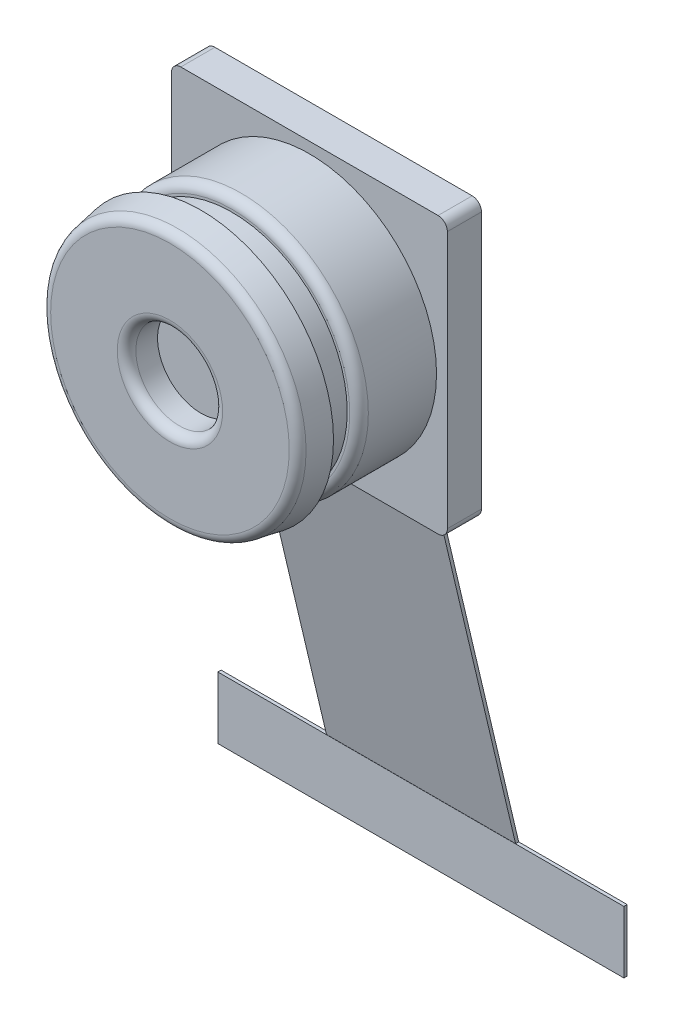
ISO-10303-21;
HEADER;
FILE_DESCRIPTION(('STEP AP214'),'2;1');
FILE_NAME('part.step','',(''),(''),'','','');
FILE_SCHEMA(('AUTOMOTIVE_DESIGN { 1 0 10303 214 1 1 1 1 }'));
ENDSEC;
DATA;
#1=APPLICATION_CONTEXT('core data for automotive mechanical design processes');
#2=APPLICATION_PROTOCOL_DEFINITION('international standard','automotive_design',2000,#1);
#3=PRODUCT_CONTEXT('',#1,'mechanical');
#4=PRODUCT('Part','Part','',(#3));
#5=PRODUCT_RELATED_PRODUCT_CATEGORY('part','',(#4));
#6=PRODUCT_DEFINITION_FORMATION('','',#4);
#7=PRODUCT_DEFINITION_CONTEXT('part definition',#1,'design');
#8=PRODUCT_DEFINITION('design','',#6,#7);
#9=PRODUCT_DEFINITION_SHAPE('','',#8);
#10=(LENGTH_UNIT() NAMED_UNIT(*) SI_UNIT(.MILLI.,.METRE.));
#11=(NAMED_UNIT(*) PLANE_ANGLE_UNIT() SI_UNIT($,.RADIAN.));
#12=(NAMED_UNIT(*) SI_UNIT($,.STERADIAN.) SOLID_ANGLE_UNIT());
#13=UNCERTAINTY_MEASURE_WITH_UNIT(LENGTH_MEASURE(1.E-05),#10,'distance_accuracy_value','');
#14=(GEOMETRIC_REPRESENTATION_CONTEXT(3) GLOBAL_UNCERTAINTY_ASSIGNED_CONTEXT((#13)) GLOBAL_UNIT_ASSIGNED_CONTEXT((#10,
#11,#12)) REPRESENTATION_CONTEXT('',''));
#15=CARTESIAN_POINT('',(0.,0.,0.));
#16=DIRECTION('',(0.,0.,1.));
#17=DIRECTION('',(1.,0.,0.));
#18=AXIS2_PLACEMENT_3D('',#15,#16,#17);
#19=CARTESIAN_POINT('',(-0.396010785207714,1.78,5.6));
#20=DIRECTION('',(0.,0.,-1.));
#21=DIRECTION('',(-1.,0.,0.));
#22=AXIS2_PLACEMENT_3D('',#19,#20,#21);
#23=CYLINDRICAL_SURFACE('',#22,3.71911807197977);
#24=CARTESIAN_POINT('',(-0.396010785207714,1.78,3.6));
#25=DIRECTION('',(0.,0.,1.));
#26=DIRECTION('',(1.,0.,0.));
#27=AXIS2_PLACEMENT_3D('',#24,#25,#26);
#28=CIRCLE('',#27,3.71911807197977);
#29=CARTESIAN_POINT('',(3.32310728677206,1.78,3.6));
#30=VERTEX_POINT('',#29);
#31=EDGE_CURVE('E187',#30,#30,#28,.T.);
#32=ORIENTED_EDGE('',*,*,#31,.T.);
#33=EDGE_LOOP('',(#32));
#34=FACE_BOUND('',#33,.T.);
#35=CARTESIAN_POINT('',(-0.396010785207714,1.78,4.6));
#36=DIRECTION('',(0.,0.,1.));
#37=DIRECTION('',(1.,0.,0.));
#38=AXIS2_PLACEMENT_3D('',#35,#36,#37);
#39=CIRCLE('',#38,3.71911807197977);
#40=CARTESIAN_POINT('',(3.32310728677206,1.78,4.6));
#41=VERTEX_POINT('',#40);
#42=EDGE_CURVE('E183',#41,#41,#39,.T.);
#43=ORIENTED_EDGE('',*,*,#42,.F.);
#44=EDGE_LOOP('',(#43));
#45=FACE_BOUND('',#44,.T.);
#46=ADVANCED_FACE('F37',(#34,#45),#23,.T.);
#47=CARTESIAN_POINT('',(-4.84601078520772,6.23,0.1));
#48=DIRECTION('',(1.,0.,0.));
#49=DIRECTION('',(0.,1.,0.));
#50=AXIS2_PLACEMENT_3D('',#47,#48,#49);
#51=PLANE('',#50);
#52=DIRECTION('',(0.,-1.,0.));
#53=VECTOR('',#52,1.);
#54=CARTESIAN_POINT('',(-4.84601078520772,6.23,0.));
#55=LINE('',#54,#53);
#56=CARTESIAN_POINT('',(-4.84601078520772,5.93,0.));
#57=VERTEX_POINT('',#56);
#58=CARTESIAN_POINT('',(-4.84601078520772,-2.37,0.));
#59=VERTEX_POINT('',#58);
#60=EDGE_CURVE('E281',#57,#59,#55,.T.);
#61=ORIENTED_EDGE('',*,*,#60,.T.);
#62=DIRECTION('',(0.,0.,-1.));
#63=VECTOR('',#62,1.);
#64=CARTESIAN_POINT('',(-4.84601078520772,-2.37,0.1));
#65=LINE('',#64,#63);
#66=CARTESIAN_POINT('',(-4.84601078520772,-2.37,1.1));
#67=VERTEX_POINT('',#66);
#68=EDGE_CURVE('E232',#59,#67,#65,.F.);
#69=ORIENTED_EDGE('',*,*,#68,.T.);
#70=DIRECTION('',(0.,-1.,0.));
#71=VECTOR('',#70,1.);
#72=CARTESIAN_POINT('',(-4.84601078520772,6.23,1.1));
#73=LINE('',#72,#71);
#74=CARTESIAN_POINT('',(-4.84601078520772,5.93,1.1));
#75=VERTEX_POINT('',#74);
#76=EDGE_CURVE('E260',#75,#67,#73,.T.);
#77=ORIENTED_EDGE('',*,*,#76,.F.);
#78=DIRECTION('',(0.,0.,-1.));
#79=VECTOR('',#78,1.);
#80=CARTESIAN_POINT('',(-4.84601078520772,5.93,0.1));
#81=LINE('',#80,#79);
#82=EDGE_CURVE('E229',#75,#57,#81,.T.);
#83=ORIENTED_EDGE('',*,*,#82,.T.);
#84=EDGE_LOOP('',(#61,#69,#77,#83));
#85=FACE_BOUND('',#84,.T.);
#86=ADVANCED_FACE('F370',(#85),#51,.F.);
#87=CARTESIAN_POINT('',(-3.44601078520772,-2.67,0.1));
#88=DIRECTION('',(1.,0.,0.));
#89=DIRECTION('',(0.,1.,0.));
#90=AXIS2_PLACEMENT_3D('',#87,#88,#89);
#91=PLANE('',#90);
#92=DIRECTION('',(0.,0.,-1.));
#93=VECTOR('',#92,1.);
#94=CARTESIAN_POINT('',(-3.44601078520771,-13.67,0.1));
#95=LINE('',#94,#93);
#96=CARTESIAN_POINT('',(-3.44601078520771,-13.67,-2.5));
#97=VERTEX_POINT('',#96);
#98=CARTESIAN_POINT('',(-3.44601078520771,-13.67,-2.6));
#99=VERTEX_POINT('',#98);
#100=EDGE_CURVE('E172',#97,#99,#95,.T.);
#101=ORIENTED_EDGE('',*,*,#100,.F.);
#102=DIRECTION('',(0.,-0.97318461277641,-0.23002545392897));
#103=VECTOR('',#102,1.);
#104=CARTESIAN_POINT('',(-3.44601078520772,-2.67,0.1));
#105=LINE('',#104,#103);
#106=CARTESIAN_POINT('',(-3.44601078520772,-2.67,0.1));
#107=VERTEX_POINT('',#106);
#108=EDGE_CURVE('E334',#107,#97,#105,.T.);
#109=ORIENTED_EDGE('',*,*,#108,.F.);
#110=DIRECTION('',(0.,0.,-1.));
#111=VECTOR('',#110,1.);
#112=CARTESIAN_POINT('',(-3.44601078520772,-2.67,0.1));
#113=LINE('',#112,#111);
#114=CARTESIAN_POINT('',(-3.44601078520772,-2.67,0.));
#115=VERTEX_POINT('',#114);
#116=EDGE_CURVE('E174',#107,#115,#113,.T.);
#117=ORIENTED_EDGE('',*,*,#116,.T.);
#118=DIRECTION('',(0.,0.97318461277641,0.23002545392897));
#119=VECTOR('',#118,1.);
#120=CARTESIAN_POINT('',(-3.44601078520772,-2.67,0.));
#121=LINE('',#120,#119);
#122=EDGE_CURVE('E326',#99,#115,#121,.T.);
#123=ORIENTED_EDGE('',*,*,#122,.F.);
#124=EDGE_LOOP('',(#101,#109,#117,#123));
#125=FACE_BOUND('',#124,.T.);
#126=ADVANCED_FACE('F346',(#125),#91,.F.);
#127=CARTESIAN_POINT('',(-6.94601078520771,-13.67,0.1));
#128=DIRECTION('',(1.,0.,0.));
#129=DIRECTION('',(0.,0.,-1.));
#130=AXIS2_PLACEMENT_3D('',#127,#128,#129);
#131=PLANE('',#130);
#132=DIRECTION('',(0.,0.,-1.));
#133=VECTOR('',#132,1.);
#134=CARTESIAN_POINT('',(-6.94601078520771,-15.67,0.1));
#135=LINE('',#134,#133);
#136=CARTESIAN_POINT('',(-6.94601078520771,-15.67,-2.49407294755794));
#137=VERTEX_POINT('',#136);
#138=CARTESIAN_POINT('',(-6.94601078520771,-15.67,-2.6));
#139=VERTEX_POINT('',#138);
#140=EDGE_CURVE('E165',#137,#139,#135,.T.);
#141=ORIENTED_EDGE('',*,*,#140,.F.);
#142=DIRECTION('',(0.,-1.,0.));
#143=VECTOR('',#142,1.);
#144=CARTESIAN_POINT('',(-6.94601078520771,-15.67,-2.49407294755794));
#145=LINE('',#144,#143);
#146=CARTESIAN_POINT('',(-6.94601078520771,-13.67,-2.49407294755794));
#147=VERTEX_POINT('',#146);
#148=EDGE_CURVE('E152',#147,#137,#145,.T.);
#149=ORIENTED_EDGE('',*,*,#148,.F.);
#150=DIRECTION('',(0.,0.,-1.));
#151=VECTOR('',#150,1.);
#152=CARTESIAN_POINT('',(-6.94601078520771,-13.67,0.1));
#153=LINE('',#152,#151);
#154=CARTESIAN_POINT('',(-6.94601078520771,-13.67,-2.6));
#155=VERTEX_POINT('',#154);
#156=EDGE_CURVE('E163',#147,#155,#153,.T.);
#157=ORIENTED_EDGE('',*,*,#156,.T.);
#158=DIRECTION('',(0.,1.,0.));
#159=VECTOR('',#158,1.);
#160=CARTESIAN_POINT('',(-6.94601078520771,-13.67,-2.6));
#161=LINE('',#160,#159);
#162=EDGE_CURVE('E262',#139,#155,#161,.T.);
#163=ORIENTED_EDGE('',*,*,#162,.F.);
#164=EDGE_LOOP('',(#141,#149,#157,#163));
#165=FACE_BOUND('',#164,.T.);
#166=ADVANCED_FACE('F161',(#165),#131,.F.);
#167=CARTESIAN_POINT('',(-6.94601078520771,-15.67,0.1));
#168=DIRECTION('',(0.,1.,0.));
#169=DIRECTION('',(0.,0.,1.));
#170=AXIS2_PLACEMENT_3D('',#167,#168,#169);
#171=PLANE('',#170);
#172=DIRECTION('',(0.,0.,-1.));
#173=VECTOR('',#172,1.);
#174=CARTESIAN_POINT('',(6.15398921479229,-15.67,0.1));
#175=LINE('',#174,#173);
#176=CARTESIAN_POINT('',(6.15398921479229,-15.67,-2.49407294755794));
#177=VERTEX_POINT('',#176);
#178=CARTESIAN_POINT('',(6.15398921479229,-15.67,-2.6));
#179=VERTEX_POINT('',#178);
#180=EDGE_CURVE('E176',#177,#179,#175,.T.);
#181=ORIENTED_EDGE('',*,*,#180,.F.);
#182=DIRECTION('',(-1.,0.,0.));
#183=VECTOR('',#182,1.);
#184=CARTESIAN_POINT('',(6.15498921479229,-15.67,-2.49407294755794));
#185=LINE('',#184,#183);
#186=EDGE_CURVE('E157',#177,#137,#185,.T.);
#187=ORIENTED_EDGE('',*,*,#186,.T.);
#188=ORIENTED_EDGE('',*,*,#140,.T.);
#189=DIRECTION('',(-1.,0.,0.));
#190=VECTOR('',#189,1.);
#191=CARTESIAN_POINT('',(-6.94601078520771,-15.67,-2.6));
#192=LINE('',#191,#190);
#193=EDGE_CURVE('E315',#179,#139,#192,.T.);
#194=ORIENTED_EDGE('',*,*,#193,.F.);
#195=EDGE_LOOP('',(#181,#187,#188,#194));
#196=FACE_BOUND('',#195,.T.);
#197=ADVANCED_FACE('F320',(#196),#171,.F.);
#198=CARTESIAN_POINT('',(6.15398921479229,-13.67,0.1));
#199=DIRECTION('',(-1.,0.,0.));
#200=DIRECTION('',(0.,0.,1.));
#201=AXIS2_PLACEMENT_3D('',#198,#199,#200);
#202=PLANE('',#201);
#203=DIRECTION('',(0.,0.,-1.));
#204=VECTOR('',#203,1.);
#205=CARTESIAN_POINT('',(6.15398921479229,-13.67,0.1));
#206=LINE('',#205,#204);
#207=CARTESIAN_POINT('',(6.15398921479229,-13.67,-2.49407294755794));
#208=VERTEX_POINT('',#207);
#209=CARTESIAN_POINT('',(6.15398921479229,-13.67,-2.6));
#210=VERTEX_POINT('',#209);
#211=EDGE_CURVE('E303',#208,#210,#206,.T.);
#212=ORIENTED_EDGE('',*,*,#211,.F.);
#213=DIRECTION('',(0.,1.,0.));
#214=VECTOR('',#213,1.);
#215=CARTESIAN_POINT('',(6.15398921479229,-15.67,-2.49407294755794));
#216=LINE('',#215,#214);
#217=EDGE_CURVE('E52',#177,#208,#216,.T.);
#218=ORIENTED_EDGE('',*,*,#217,.F.);
#219=ORIENTED_EDGE('',*,*,#180,.T.);
#220=DIRECTION('',(0.,-1.,0.));
#221=VECTOR('',#220,1.);
#222=CARTESIAN_POINT('',(6.15398921479229,-13.67,-2.6));
#223=LINE('',#222,#221);
#224=EDGE_CURVE('E309',#210,#179,#223,.T.);
#225=ORIENTED_EDGE('',*,*,#224,.F.);
#226=EDGE_LOOP('',(#212,#218,#219,#225));
#227=FACE_BOUND('',#226,.T.);
#228=ADVANCED_FACE('F308',(#227),#202,.F.);
#229=CARTESIAN_POINT('',(2.65398921479229,-13.67,0.1));
#230=DIRECTION('',(0.,-1.,0.));
#231=DIRECTION('',(0.,0.,-1.));
#232=AXIS2_PLACEMENT_3D('',#229,#230,#231);
#233=PLANE('',#232);
#234=ORIENTED_EDGE('',*,*,#156,.F.);
#235=DIRECTION('',(-1.,0.,0.));
#236=VECTOR('',#235,1.);
#237=CARTESIAN_POINT('',(6.15498921479229,-13.67,-2.49407294755794));
#238=LINE('',#237,#236);
#239=EDGE_CURVE('E149',#208,#147,#238,.T.);
#240=ORIENTED_EDGE('',*,*,#239,.F.);
#241=ORIENTED_EDGE('',*,*,#211,.T.);
#242=DIRECTION('',(1.,0.,0.));
#243=VECTOR('',#242,1.);
#244=CARTESIAN_POINT('',(2.65398921479229,-13.67,-2.6));
#245=LINE('',#244,#243);
#246=CARTESIAN_POINT('',(2.65398921479229,-13.67,-2.6));
#247=VERTEX_POINT('',#246);
#248=EDGE_CURVE('E318',#247,#210,#245,.T.);
#249=ORIENTED_EDGE('',*,*,#248,.F.);
#250=DIRECTION('',(0.,0.,-1.));
#251=VECTOR('',#250,1.);
#252=CARTESIAN_POINT('',(2.65398921479229,-13.67,0.1));
#253=LINE('',#252,#251);
#254=CARTESIAN_POINT('',(2.65398921479229,-13.67,-2.5));
#255=VERTEX_POINT('',#254);
#256=EDGE_CURVE('E300',#255,#247,#253,.T.);
#257=ORIENTED_EDGE('',*,*,#256,.F.);
#258=DIRECTION('',(-1.,0.,0.));
#259=VECTOR('',#258,1.);
#260=CARTESIAN_POINT('',(6.15498921479229,-13.67,-2.5));
#261=LINE('',#260,#259);
#262=EDGE_CURVE('E332',#255,#97,#261,.T.);
#263=ORIENTED_EDGE('',*,*,#262,.T.);
#264=ORIENTED_EDGE('',*,*,#100,.T.);
#265=DIRECTION('',(1.,0.,0.));
#266=VECTOR('',#265,1.);
#267=CARTESIAN_POINT('',(-6.94601078520771,-13.67,-2.6));
#268=LINE('',#267,#266);
#269=EDGE_CURVE('E171',#155,#99,#268,.T.);
#270=ORIENTED_EDGE('',*,*,#269,.F.);
#271=EDGE_LOOP('',(#234,#240,#241,#249,#257,#263,#264,#270));
#272=FACE_BOUND('',#271,.T.);
#273=ADVANCED_FACE('F168',(#272),#233,.F.);
#274=CARTESIAN_POINT('',(2.65398921479229,-2.67,0.1));
#275=DIRECTION('',(-1.,0.,0.));
#276=DIRECTION('',(0.,-1.,0.));
#277=AXIS2_PLACEMENT_3D('',#274,#275,#276);
#278=PLANE('',#277);
#279=DIRECTION('',(0.,0.,-1.));
#280=VECTOR('',#279,1.);
#281=CARTESIAN_POINT('',(2.65398921479229,-2.67,0.1));
#282=LINE('',#281,#280);
#283=CARTESIAN_POINT('',(2.65398921479229,-2.67,0.1));
#284=VERTEX_POINT('',#283);
#285=CARTESIAN_POINT('',(2.65398921479229,-2.67,0.));
#286=VERTEX_POINT('',#285);
#287=EDGE_CURVE('E297',#284,#286,#282,.T.);
#288=ORIENTED_EDGE('',*,*,#287,.F.);
#289=DIRECTION('',(0.,0.97318461277641,0.23002545392897));
#290=VECTOR('',#289,1.);
#291=CARTESIAN_POINT('',(2.65398921479229,-2.67,0.0999999999999999));
#292=LINE('',#291,#290);
#293=EDGE_CURVE('E330',#255,#284,#292,.T.);
#294=ORIENTED_EDGE('',*,*,#293,.F.);
#295=ORIENTED_EDGE('',*,*,#256,.T.);
#296=DIRECTION('',(0.,-0.97318461277641,-0.23002545392897));
#297=VECTOR('',#296,1.);
#298=CARTESIAN_POINT('',(2.65398921479229,-2.67,0.));
#299=LINE('',#298,#297);
#300=EDGE_CURVE('E328',#286,#247,#299,.T.);
#301=ORIENTED_EDGE('',*,*,#300,.F.);
#302=EDGE_LOOP('',(#288,#294,#295,#301));
#303=FACE_BOUND('',#302,.T.);
#304=ADVANCED_FACE('F352',(#303),#278,.F.);
#305=CARTESIAN_POINT('',(2.65398921479229,-2.67,0.1));
#306=DIRECTION('',(0.,1.,0.));
#307=DIRECTION('',(0.,0.,1.));
#308=AXIS2_PLACEMENT_3D('',#305,#306,#307);
#309=PLANE('',#308);
#310=DIRECTION('',(1.,0.,0.));
#311=VECTOR('',#310,1.);
#312=CARTESIAN_POINT('',(2.65398921479229,-2.67,0.));
#313=LINE('',#312,#311);
#314=CARTESIAN_POINT('',(3.75398921479229,-2.67,0.));
#315=VERTEX_POINT('',#314);
#316=EDGE_CURVE('E289',#286,#315,#313,.T.);
#317=ORIENTED_EDGE('',*,*,#316,.T.);
#318=DIRECTION('',(0.,0.,-1.));
#319=VECTOR('',#318,1.);
#320=CARTESIAN_POINT('',(3.75398921479229,-2.67,0.1));
#321=LINE('',#320,#319);
#322=CARTESIAN_POINT('',(3.75398921479229,-2.67,1.1));
#323=VERTEX_POINT('',#322);
#324=EDGE_CURVE('E60',#315,#323,#321,.F.);
#325=ORIENTED_EDGE('',*,*,#324,.T.);
#326=DIRECTION('',(1.,0.,0.));
#327=VECTOR('',#326,1.);
#328=CARTESIAN_POINT('',(-4.84601078520772,-2.67,1.1));
#329=LINE('',#328,#327);
#330=CARTESIAN_POINT('',(-4.54601078520772,-2.67,1.1));
#331=VERTEX_POINT('',#330);
#332=EDGE_CURVE('E273',#331,#323,#329,.T.);
#333=ORIENTED_EDGE('',*,*,#332,.F.);
#334=DIRECTION('',(0.,0.,-1.));
#335=VECTOR('',#334,1.);
#336=CARTESIAN_POINT('',(-4.54601078520772,-2.67,0.1));
#337=LINE('',#336,#335);
#338=CARTESIAN_POINT('',(-4.54601078520772,-2.67,0.));
#339=VERTEX_POINT('',#338);
#340=EDGE_CURVE('E225',#331,#339,#337,.T.);
#341=ORIENTED_EDGE('',*,*,#340,.T.);
#342=DIRECTION('',(1.,0.,0.));
#343=VECTOR('',#342,1.);
#344=CARTESIAN_POINT('',(-4.84601078520772,-2.67,0.));
#345=LINE('',#344,#343);
#346=EDGE_CURVE('E286',#339,#115,#345,.T.);
#347=ORIENTED_EDGE('',*,*,#346,.T.);
#348=ORIENTED_EDGE('',*,*,#116,.F.);
#349=DIRECTION('',(1.,0.,0.));
#350=VECTOR('',#349,1.);
#351=CARTESIAN_POINT('',(-4.84601078520772,-2.67,0.1));
#352=LINE('',#351,#350);
#353=EDGE_CURVE('E182',#107,#284,#352,.T.);
#354=ORIENTED_EDGE('',*,*,#353,.T.);
#355=ORIENTED_EDGE('',*,*,#287,.T.);
#356=EDGE_LOOP('',(#317,#325,#333,#341,#347,#348,#354,#355));
#357=FACE_BOUND('',#356,.T.);
#358=ADVANCED_FACE('F354',(#357),#309,.F.);
#359=CARTESIAN_POINT('',(4.05398921479228,6.23,0.1));
#360=DIRECTION('',(-1.,0.,0.));
#361=DIRECTION('',(0.,-1.,0.));
#362=AXIS2_PLACEMENT_3D('',#359,#360,#361);
#363=PLANE('',#362);
#364=DIRECTION('',(0.,1.,0.));
#365=VECTOR('',#364,1.);
#366=CARTESIAN_POINT('',(4.05398921479228,6.23,0.));
#367=LINE('',#366,#365);
#368=CARTESIAN_POINT('',(4.05398921479229,-2.37,0.));
#369=VERTEX_POINT('',#368);
#370=CARTESIAN_POINT('',(4.05398921479228,5.93,0.));
#371=VERTEX_POINT('',#370);
#372=EDGE_CURVE('E291',#369,#371,#367,.T.);
#373=ORIENTED_EDGE('',*,*,#372,.T.);
#374=DIRECTION('',(0.,0.,-1.));
#375=VECTOR('',#374,1.);
#376=CARTESIAN_POINT('',(4.05398921479228,5.93,0.1));
#377=LINE('',#376,#375);
#378=CARTESIAN_POINT('',(4.05398921479229,5.93,1.1));
#379=VERTEX_POINT('',#378);
#380=EDGE_CURVE('E215',#371,#379,#377,.F.);
#381=ORIENTED_EDGE('',*,*,#380,.T.);
#382=DIRECTION('',(0.,1.,0.));
#383=VECTOR('',#382,1.);
#384=CARTESIAN_POINT('',(4.05398921479229,6.23,1.1));
#385=LINE('',#384,#383);
#386=CARTESIAN_POINT('',(4.05398921479229,-2.37,1.1));
#387=VERTEX_POINT('',#386);
#388=EDGE_CURVE('E275',#387,#379,#385,.T.);
#389=ORIENTED_EDGE('',*,*,#388,.F.);
#390=DIRECTION('',(0.,0.,-1.));
#391=VECTOR('',#390,1.);
#392=CARTESIAN_POINT('',(4.05398921479229,-2.37,0.1));
#393=LINE('',#392,#391);
#394=EDGE_CURVE('E212',#387,#369,#393,.T.);
#395=ORIENTED_EDGE('',*,*,#394,.T.);
#396=EDGE_LOOP('',(#373,#381,#389,#395));
#397=FACE_BOUND('',#396,.T.);
#398=ADVANCED_FACE('F400',(#397),#363,.F.);
#399=CARTESIAN_POINT('',(-4.84601078520772,6.23,0.1));
#400=DIRECTION('',(0.,-1.,0.));
#401=DIRECTION('',(0.,0.,-1.));
#402=AXIS2_PLACEMENT_3D('',#399,#400,#401);
#403=PLANE('',#402);
#404=DIRECTION('',(-1.,0.,0.));
#405=VECTOR('',#404,1.);
#406=CARTESIAN_POINT('',(-4.84601078520772,6.23,1.1));
#407=LINE('',#406,#405);
#408=CARTESIAN_POINT('',(3.75398921479228,6.23,1.1));
#409=VERTEX_POINT('',#408);
#410=CARTESIAN_POINT('',(-4.54601078520772,6.23,1.1));
#411=VERTEX_POINT('',#410);
#412=EDGE_CURVE('E278',#409,#411,#407,.T.);
#413=ORIENTED_EDGE('',*,*,#412,.F.);
#414=DIRECTION('',(0.,0.,-1.));
#415=VECTOR('',#414,1.);
#416=CARTESIAN_POINT('',(3.75398921479228,6.23,0.1));
#417=LINE('',#416,#415);
#418=CARTESIAN_POINT('',(3.75398921479228,6.23,0.));
#419=VERTEX_POINT('',#418);
#420=EDGE_CURVE('E201',#409,#419,#417,.T.);
#421=ORIENTED_EDGE('',*,*,#420,.T.);
#422=DIRECTION('',(-1.,0.,0.));
#423=VECTOR('',#422,1.);
#424=CARTESIAN_POINT('',(-4.84601078520772,6.23,0.));
#425=LINE('',#424,#423);
#426=CARTESIAN_POINT('',(-4.54601078520772,6.23,0.));
#427=VERTEX_POINT('',#426);
#428=EDGE_CURVE('E294',#419,#427,#425,.T.);
#429=ORIENTED_EDGE('',*,*,#428,.T.);
#430=DIRECTION('',(0.,0.,-1.));
#431=VECTOR('',#430,1.);
#432=CARTESIAN_POINT('',(-4.54601078520772,6.23,0.1));
#433=LINE('',#432,#431);
#434=EDGE_CURVE('E199',#427,#411,#433,.F.);
#435=ORIENTED_EDGE('',*,*,#434,.T.);
#436=EDGE_LOOP('',(#413,#421,#429,#435));
#437=FACE_BOUND('',#436,.T.);
#438=ADVANCED_FACE('F397',(#437),#403,.F.);
#439=CARTESIAN_POINT('',(0.,0.,0.));
#440=DIRECTION('',(0.,0.,1.));
#441=DIRECTION('',(1.,0.,0.));
#442=AXIS2_PLACEMENT_3D('',#439,#440,#441);
#443=PLANE('',#442);
#444=ORIENTED_EDGE('',*,*,#316,.F.);
#445=DIRECTION('',(-1.,0.,0.));
#446=VECTOR('',#445,1.);
#447=CARTESIAN_POINT('',(0.,-2.67,0.));
#448=LINE('',#447,#446);
#449=EDGE_CURVE('E11',#286,#115,#448,.T.);
#450=ORIENTED_EDGE('',*,*,#449,.T.);
#451=ORIENTED_EDGE('',*,*,#346,.F.);
#452=CARTESIAN_POINT('',(-4.54601078520772,-2.37,0.));
#453=DIRECTION('',(0.,0.,1.));
#454=DIRECTION('',(1.,0.,0.));
#455=AXIS2_PLACEMENT_3D('',#452,#453,#454);
#456=CIRCLE('',#455,0.3);
#457=EDGE_CURVE('E206',#339,#59,#456,.F.);
#458=ORIENTED_EDGE('',*,*,#457,.T.);
#459=ORIENTED_EDGE('',*,*,#60,.F.);
#460=CARTESIAN_POINT('',(-4.54601078520772,5.93,0.));
#461=DIRECTION('',(0.,0.,1.));
#462=DIRECTION('',(1.,0.,0.));
#463=AXIS2_PLACEMENT_3D('',#460,#461,#462);
#464=CIRCLE('',#463,0.3);
#465=EDGE_CURVE('E204',#57,#427,#464,.F.);
#466=ORIENTED_EDGE('',*,*,#465,.T.);
#467=ORIENTED_EDGE('',*,*,#428,.F.);
#468=CARTESIAN_POINT('',(3.75398921479228,5.93,0.));
#469=DIRECTION('',(0.,0.,1.));
#470=DIRECTION('',(1.,0.,0.));
#471=AXIS2_PLACEMENT_3D('',#468,#469,#470);
#472=CIRCLE('',#471,0.3);
#473=EDGE_CURVE('E210',#419,#371,#472,.F.);
#474=ORIENTED_EDGE('',*,*,#473,.T.);
#475=ORIENTED_EDGE('',*,*,#372,.F.);
#476=CARTESIAN_POINT('',(3.75398921479229,-2.37,0.));
#477=DIRECTION('',(0.,0.,1.));
#478=DIRECTION('',(1.,0.,0.));
#479=AXIS2_PLACEMENT_3D('',#476,#477,#478);
#480=CIRCLE('',#479,0.3);
#481=EDGE_CURVE('E208',#369,#315,#480,.F.);
#482=ORIENTED_EDGE('',*,*,#481,.T.);
#483=EDGE_LOOP('',(#444,#450,#451,#458,#459,#466,#467,#474,#475,#482));
#484=FACE_BOUND('',#483,.T.);
#485=ADVANCED_FACE('F358',(#484),#443,.F.);
#486=CARTESIAN_POINT('',(0.,0.,1.1));
#487=DIRECTION('',(0.,0.,1.));
#488=DIRECTION('',(1.,0.,0.));
#489=AXIS2_PLACEMENT_3D('',#486,#487,#488);
#490=PLANE('',#489);
#491=CARTESIAN_POINT('',(-0.396010785207714,1.78,1.1));
#492=DIRECTION('',(0.,0.,1.));
#493=DIRECTION('',(1.,0.,0.));
#494=AXIS2_PLACEMENT_3D('',#491,#492,#493);
#495=CIRCLE('',#494,4.1);
#496=CARTESIAN_POINT('',(3.70398921479229,1.78,1.1));
#497=VERTEX_POINT('',#496);
#498=EDGE_CURVE('E268',#497,#497,#495,.T.);
#499=ORIENTED_EDGE('',*,*,#498,.F.);
#500=EDGE_LOOP('',(#499));
#501=FACE_BOUND('',#500,.T.);
#502=ORIENTED_EDGE('',*,*,#388,.T.);
#503=CARTESIAN_POINT('',(3.75398921479228,5.93,1.1));
#504=DIRECTION('',(0.,0.,1.));
#505=DIRECTION('',(1.,0.,0.));
#506=AXIS2_PLACEMENT_3D('',#503,#504,#505);
#507=CIRCLE('',#506,0.3);
#508=EDGE_CURVE('E223',#379,#409,#507,.T.);
#509=ORIENTED_EDGE('',*,*,#508,.T.);
#510=ORIENTED_EDGE('',*,*,#412,.T.);
#511=CARTESIAN_POINT('',(-4.54601078520772,5.93,1.1));
#512=DIRECTION('',(0.,0.,1.));
#513=DIRECTION('',(1.,0.,0.));
#514=AXIS2_PLACEMENT_3D('',#511,#512,#513);
#515=CIRCLE('',#514,0.3);
#516=EDGE_CURVE('E217',#411,#75,#515,.T.);
#517=ORIENTED_EDGE('',*,*,#516,.T.);
#518=ORIENTED_EDGE('',*,*,#76,.T.);
#519=CARTESIAN_POINT('',(-4.54601078520772,-2.37,1.1));
#520=DIRECTION('',(0.,0.,1.));
#521=DIRECTION('',(1.,0.,0.));
#522=AXIS2_PLACEMENT_3D('',#519,#520,#521);
#523=CIRCLE('',#522,0.3);
#524=EDGE_CURVE('E219',#67,#331,#523,.T.);
#525=ORIENTED_EDGE('',*,*,#524,.T.);
#526=ORIENTED_EDGE('',*,*,#332,.T.);
#527=CARTESIAN_POINT('',(3.75398921479229,-2.37,1.1));
#528=DIRECTION('',(0.,0.,1.));
#529=DIRECTION('',(1.,0.,0.));
#530=AXIS2_PLACEMENT_3D('',#527,#528,#529);
#531=CIRCLE('',#530,0.3);
#532=EDGE_CURVE('E221',#323,#387,#531,.T.);
#533=ORIENTED_EDGE('',*,*,#532,.T.);
#534=EDGE_LOOP('',(#502,#509,#510,#517,#518,#525,#526,#533));
#535=FACE_BOUND('',#534,.T.);
#536=ADVANCED_FACE('F390',(#501,#535),#490,.T.);
#537=CARTESIAN_POINT('',(-0.396010785207714,1.78,3.6));
#538=DIRECTION('',(0.,0.,-1.));
#539=DIRECTION('',(-1.,0.,0.));
#540=AXIS2_PLACEMENT_3D('',#537,#538,#539);
#541=CYLINDRICAL_SURFACE('',#540,4.1);
#542=CARTESIAN_POINT('',(-0.396010785207714,1.78,3.3));
#543=DIRECTION('',(0.,0.,1.));
#544=DIRECTION('',(1.,0.,0.));
#545=AXIS2_PLACEMENT_3D('',#542,#543,#544);
#546=CIRCLE('',#545,4.1);
#547=CARTESIAN_POINT('',(3.70398921479229,1.78,3.3));
#548=VERTEX_POINT('',#547);
#549=EDGE_CURVE('E190',#548,#548,#546,.F.);
#550=ORIENTED_EDGE('',*,*,#549,.T.);
#551=EDGE_LOOP('',(#550));
#552=FACE_BOUND('',#551,.T.);
#553=ORIENTED_EDGE('',*,*,#498,.T.);
#554=EDGE_LOOP('',(#553));
#555=FACE_BOUND('',#554,.T.);
#556=ADVANCED_FACE('F386',(#552,#555),#541,.T.);
#557=CARTESIAN_POINT('',(-0.396010785207714,1.78,3.6));
#558=DIRECTION('',(0.,0.,1.));
#559=DIRECTION('',(1.,0.,0.));
#560=AXIS2_PLACEMENT_3D('',#557,#558,#559);
#561=PLANE('',#560);
#562=CARTESIAN_POINT('',(-0.396010785207714,1.78,3.6));
#563=DIRECTION('',(0.,0.,1.));
#564=DIRECTION('',(1.,0.,0.));
#565=AXIS2_PLACEMENT_3D('',#562,#563,#564);
#566=CIRCLE('',#565,3.8);
#567=CARTESIAN_POINT('',(3.40398921479229,1.78,3.6));
#568=VERTEX_POINT('',#567);
#569=EDGE_CURVE('E186',#568,#568,#566,.T.);
#570=ORIENTED_EDGE('',*,*,#569,.T.);
#571=EDGE_LOOP('',(#570));
#572=FACE_BOUND('',#571,.T.);
#573=ORIENTED_EDGE('',*,*,#31,.F.);
#574=EDGE_LOOP('',(#573));
#575=FACE_BOUND('',#574,.T.);
#576=ADVANCED_FACE('F382',(#572,#575),#561,.T.);
#577=CARTESIAN_POINT('',(-0.396010785207714,1.78,5.6));
#578=DIRECTION('',(0.,0.,-1.));
#579=DIRECTION('',(1.,0.,0.));
#580=AXIS2_PLACEMENT_3D('',#577,#578,#579);
#581=CONICAL_SURFACE('',#580,4.1,0.174532925199433);
#582=CARTESIAN_POINT('',(-0.396010785207714,1.78,5.35209445330008));
#583=DIRECTION('',(0.,0.,1.));
#584=DIRECTION('',(1.,0.,0.));
#585=AXIS2_PLACEMENT_3D('',#582,#583,#584);
#586=CIRCLE('',#585,4.14371243655048);
#587=CARTESIAN_POINT('',(3.74770165134276,1.78,5.35209445330008));
#588=VERTEX_POINT('',#587);
#589=EDGE_CURVE('E196',#588,#588,#586,.F.);
#590=ORIENTED_EDGE('',*,*,#589,.T.);
#591=EDGE_LOOP('',(#590));
#592=FACE_BOUND('',#591,.T.);
#593=CARTESIAN_POINT('',(-0.396010785207714,1.78,4.6));
#594=DIRECTION('',(0.,0.,1.));
#595=DIRECTION('',(1.,0.,0.));
#596=AXIS2_PLACEMENT_3D('',#593,#594,#595);
#597=CIRCLE('',#596,4.27632698070846);
#598=CARTESIAN_POINT('',(3.88031619550075,1.78,4.6));
#599=VERTEX_POINT('',#598);
#600=EDGE_CURVE('E257',#599,#599,#597,.T.);
#601=ORIENTED_EDGE('',*,*,#600,.T.);
#602=EDGE_LOOP('',(#601));
#603=FACE_BOUND('',#602,.T.);
#604=ADVANCED_FACE('F385',(#592,#603),#581,.T.);
#605=CARTESIAN_POINT('',(-0.396010785207714,1.78,4.6));
#606=DIRECTION('',(0.,0.,1.));
#607=DIRECTION('',(1.,0.,0.));
#608=AXIS2_PLACEMENT_3D('',#605,#606,#607);
#609=PLANE('',#608);
#610=ORIENTED_EDGE('',*,*,#42,.T.);
#611=EDGE_LOOP('',(#610));
#612=FACE_BOUND('',#611,.T.);
#613=ORIENTED_EDGE('',*,*,#600,.F.);
#614=EDGE_LOOP('',(#613));
#615=FACE_BOUND('',#614,.T.);
#616=ADVANCED_FACE('F564',(#612,#615),#609,.F.);
#617=CARTESIAN_POINT('',(-0.396010785207714,1.78,5.6));
#618=DIRECTION('',(0.,0.,1.));
#619=DIRECTION('',(1.,0.,0.));
#620=AXIS2_PLACEMENT_3D('',#617,#618,#619);
#621=PLANE('',#620);
#622=CARTESIAN_POINT('',(-0.396010785207714,1.78,5.6));
#623=DIRECTION('',(0.,0.,1.));
#624=DIRECTION('',(1.,0.,0.));
#625=AXIS2_PLACEMENT_3D('',#622,#623,#624);
#626=CIRCLE('',#625,1.7);
#627=CARTESIAN_POINT('',(1.30398921479229,1.78,5.6));
#628=VERTEX_POINT('',#627);
#629=EDGE_CURVE('E45',#628,#628,#626,.F.);
#630=ORIENTED_EDGE('',*,*,#629,.T.);
#631=EDGE_LOOP('',(#630));
#632=FACE_BOUND('',#631,.T.);
#633=CARTESIAN_POINT('',(-0.396010785207714,1.78,5.6));
#634=DIRECTION('',(0.,0.,1.));
#635=DIRECTION('',(1.,0.,0.));
#636=AXIS2_PLACEMENT_3D('',#633,#634,#635);
#637=CIRCLE('',#636,3.84827011064682);
#638=CARTESIAN_POINT('',(3.4522593254391,1.78,5.6));
#639=VERTEX_POINT('',#638);
#640=EDGE_CURVE('E193',#639,#639,#637,.T.);
#641=ORIENTED_EDGE('',*,*,#640,.T.);
#642=EDGE_LOOP('',(#641));
#643=FACE_BOUND('',#642,.T.);
#644=ADVANCED_FACE('F239',(#632,#643),#621,.T.);
#645=CARTESIAN_POINT('',(-0.396010785207714,1.78,4.6));
#646=DIRECTION('',(0.,0.,1.));
#647=DIRECTION('',(1.,0.,0.));
#648=AXIS2_PLACEMENT_3D('',#645,#646,#647);
#649=CYLINDRICAL_SURFACE('',#648,1.4);
#650=CARTESIAN_POINT('',(-0.396010785207714,1.78,5.3));
#651=DIRECTION('',(0.,0.,1.));
#652=DIRECTION('',(1.,0.,0.));
#653=AXIS2_PLACEMENT_3D('',#650,#651,#652);
#654=CIRCLE('',#653,1.4);
#655=CARTESIAN_POINT('',(1.00398921479229,1.78,5.3));
#656=VERTEX_POINT('',#655);
#657=EDGE_CURVE('E234',#656,#656,#654,.T.);
#658=ORIENTED_EDGE('',*,*,#657,.T.);
#659=EDGE_LOOP('',(#658));
#660=FACE_BOUND('',#659,.T.);
#661=CARTESIAN_POINT('',(-0.396010785207714,1.78,4.6));
#662=DIRECTION('',(0.,0.,1.));
#663=DIRECTION('',(1.,0.,0.));
#664=AXIS2_PLACEMENT_3D('',#661,#662,#663);
#665=CIRCLE('',#664,1.4);
#666=CARTESIAN_POINT('',(1.00398921479229,1.78,4.6));
#667=VERTEX_POINT('',#666);
#668=EDGE_CURVE('E255',#667,#667,#665,.T.);
#669=ORIENTED_EDGE('',*,*,#668,.F.);
#670=EDGE_LOOP('',(#669));
#671=FACE_BOUND('',#670,.T.);
#672=ADVANCED_FACE('F248',(#660,#671),#649,.F.);
#673=CARTESIAN_POINT('',(-0.396010785207714,1.78,4.6));
#674=DIRECTION('',(0.,0.,1.));
#675=DIRECTION('',(1.,0.,0.));
#676=AXIS2_PLACEMENT_3D('',#673,#674,#675);
#677=PLANE('',#676);
#678=ORIENTED_EDGE('',*,*,#668,.T.);
#679=EDGE_LOOP('',(#678));
#680=FACE_BOUND('',#679,.T.);
#681=ADVANCED_FACE('F251',(#680),#677,.T.);
#682=CARTESIAN_POINT('',(-0.396010785207714,1.78,3.3));
#683=DIRECTION('',(0.,0.,1.));
#684=DIRECTION('',(1.,0.,0.));
#685=AXIS2_PLACEMENT_3D('',#682,#683,#684);
#686=TOROIDAL_SURFACE('',#685,3.8,0.3);
#687=ORIENTED_EDGE('',*,*,#549,.F.);
#688=EDGE_LOOP('',(#687));
#689=FACE_BOUND('',#688,.T.);
#690=ORIENTED_EDGE('',*,*,#569,.F.);
#691=EDGE_LOOP('',(#690));
#692=FACE_BOUND('',#691,.T.);
#693=ADVANCED_FACE('F419',(#689,#692),#686,.T.);
#694=CARTESIAN_POINT('',(-0.396010785207714,1.78,5.3));
#695=DIRECTION('',(0.,0.,1.));
#696=DIRECTION('',(1.,0.,0.));
#697=AXIS2_PLACEMENT_3D('',#694,#695,#696);
#698=TOROIDAL_SURFACE('',#697,3.84827011064682,0.3);
#699=ORIENTED_EDGE('',*,*,#589,.F.);
#700=EDGE_LOOP('',(#699));
#701=FACE_BOUND('',#700,.T.);
#702=ORIENTED_EDGE('',*,*,#640,.F.);
#703=EDGE_LOOP('',(#702));
#704=FACE_BOUND('',#703,.T.);
#705=ADVANCED_FACE('F422',(#701,#704),#698,.T.);
#706=CARTESIAN_POINT('',(3.75398921479228,5.93,0.1));
#707=DIRECTION('',(0.,0.,-1.));
#708=DIRECTION('',(-1.,0.,0.));
#709=AXIS2_PLACEMENT_3D('',#706,#707,#708);
#710=CYLINDRICAL_SURFACE('',#709,0.3);
#711=ORIENTED_EDGE('',*,*,#508,.F.);
#712=ORIENTED_EDGE('',*,*,#380,.F.);
#713=ORIENTED_EDGE('',*,*,#473,.F.);
#714=ORIENTED_EDGE('',*,*,#420,.F.);
#715=EDGE_LOOP('',(#711,#712,#713,#714));
#716=FACE_BOUND('',#715,.T.);
#717=ADVANCED_FACE('F426',(#716),#710,.T.);
#718=CARTESIAN_POINT('',(3.75398921479229,-2.37,0.1));
#719=DIRECTION('',(0.,0.,-1.));
#720=DIRECTION('',(-1.,0.,0.));
#721=AXIS2_PLACEMENT_3D('',#718,#719,#720);
#722=CYLINDRICAL_SURFACE('',#721,0.3);
#723=ORIENTED_EDGE('',*,*,#532,.F.);
#724=ORIENTED_EDGE('',*,*,#324,.F.);
#725=ORIENTED_EDGE('',*,*,#481,.F.);
#726=ORIENTED_EDGE('',*,*,#394,.F.);
#727=EDGE_LOOP('',(#723,#724,#725,#726));
#728=FACE_BOUND('',#727,.T.);
#729=ADVANCED_FACE('F430',(#728),#722,.T.);
#730=CARTESIAN_POINT('',(-4.54601078520772,-2.37,0.1));
#731=DIRECTION('',(0.,0.,-1.));
#732=DIRECTION('',(-1.,0.,0.));
#733=AXIS2_PLACEMENT_3D('',#730,#731,#732);
#734=CYLINDRICAL_SURFACE('',#733,0.3);
#735=ORIENTED_EDGE('',*,*,#524,.F.);
#736=ORIENTED_EDGE('',*,*,#68,.F.);
#737=ORIENTED_EDGE('',*,*,#457,.F.);
#738=ORIENTED_EDGE('',*,*,#340,.F.);
#739=EDGE_LOOP('',(#735,#736,#737,#738));
#740=FACE_BOUND('',#739,.T.);
#741=ADVANCED_FACE('F434',(#740),#734,.T.);
#742=CARTESIAN_POINT('',(-4.54601078520772,5.93,0.1));
#743=DIRECTION('',(0.,0.,-1.));
#744=DIRECTION('',(-1.,0.,0.));
#745=AXIS2_PLACEMENT_3D('',#742,#743,#744);
#746=CYLINDRICAL_SURFACE('',#745,0.3);
#747=ORIENTED_EDGE('',*,*,#516,.F.);
#748=ORIENTED_EDGE('',*,*,#434,.F.);
#749=ORIENTED_EDGE('',*,*,#465,.F.);
#750=ORIENTED_EDGE('',*,*,#82,.F.);
#751=EDGE_LOOP('',(#747,#748,#749,#750));
#752=FACE_BOUND('',#751,.T.);
#753=ADVANCED_FACE('F245',(#752),#746,.T.);
#754=CARTESIAN_POINT('',(-0.396010785207714,1.78,5.3));
#755=DIRECTION('',(0.,0.,1.));
#756=DIRECTION('',(1.,0.,0.));
#757=AXIS2_PLACEMENT_3D('',#754,#755,#756);
#758=TOROIDAL_SURFACE('',#757,1.7,0.3);
#759=ORIENTED_EDGE('',*,*,#629,.F.);
#760=EDGE_LOOP('',(#759));
#761=FACE_BOUND('',#760,.T.);
#762=ORIENTED_EDGE('',*,*,#657,.F.);
#763=EDGE_LOOP('',(#762));
#764=FACE_BOUND('',#763,.T.);
#765=ADVANCED_FACE('F39',(#761,#764),#758,.T.);
#766=CARTESIAN_POINT('',(0.,0.,-2.6));
#767=DIRECTION('',(0.,0.,1.));
#768=DIRECTION('',(1.,0.,0.));
#769=AXIS2_PLACEMENT_3D('',#766,#767,#768);
#770=PLANE('',#769);
#771=ORIENTED_EDGE('',*,*,#269,.T.);
#772=DIRECTION('',(-1.,0.,0.));
#773=VECTOR('',#772,1.);
#774=CARTESIAN_POINT('',(6.15498921479229,-13.67,-2.6));
#775=LINE('',#774,#773);
#776=EDGE_CURVE('E324',#247,#99,#775,.T.);
#777=ORIENTED_EDGE('',*,*,#776,.F.);
#778=ORIENTED_EDGE('',*,*,#248,.T.);
#779=ORIENTED_EDGE('',*,*,#224,.T.);
#780=ORIENTED_EDGE('',*,*,#193,.T.);
#781=ORIENTED_EDGE('',*,*,#162,.T.);
#782=EDGE_LOOP('',(#771,#777,#778,#779,#780,#781));
#783=FACE_BOUND('',#782,.T.);
#784=ADVANCED_FACE('F244',(#783),#770,.F.);
#785=CARTESIAN_POINT('',(6.15498921479229,-2.67,0.));
#786=DIRECTION('',(0.,-0.23002545392897,0.97318461277641));
#787=DIRECTION('',(0.,-0.97318461277641,-0.23002545392897));
#788=AXIS2_PLACEMENT_3D('',#785,#786,#787);
#789=PLANE('',#788);
#790=ORIENTED_EDGE('',*,*,#300,.T.);
#791=ORIENTED_EDGE('',*,*,#776,.T.);
#792=ORIENTED_EDGE('',*,*,#122,.T.);
#793=ORIENTED_EDGE('',*,*,#449,.F.);
#794=EDGE_LOOP('',(#790,#791,#792,#793));
#795=FACE_BOUND('',#794,.T.);
#796=ADVANCED_FACE('F360',(#795),#789,.F.);
#797=CARTESIAN_POINT('',(6.15498921479229,-2.67,0.1));
#798=DIRECTION('',(0.,0.23002545392897,-0.97318461277641));
#799=DIRECTION('',(0.,0.97318461277641,0.23002545392897));
#800=AXIS2_PLACEMENT_3D('',#797,#798,#799);
#801=PLANE('',#800);
#802=ORIENTED_EDGE('',*,*,#293,.T.);
#803=ORIENTED_EDGE('',*,*,#353,.F.);
#804=ORIENTED_EDGE('',*,*,#108,.T.);
#805=ORIENTED_EDGE('',*,*,#262,.F.);
#806=EDGE_LOOP('',(#802,#803,#804,#805));
#807=FACE_BOUND('',#806,.T.);
#808=ADVANCED_FACE('F341',(#807),#801,.F.);
#809=CARTESIAN_POINT('',(6.15498921479229,-15.67,-2.49407294755794));
#810=DIRECTION('',(0.,0.,-1.));
#811=DIRECTION('',(-1.,0.,0.));
#812=AXIS2_PLACEMENT_3D('',#809,#810,#811);
#813=PLANE('',#812);
#814=ORIENTED_EDGE('',*,*,#217,.T.);
#815=ORIENTED_EDGE('',*,*,#239,.T.);
#816=ORIENTED_EDGE('',*,*,#148,.T.);
#817=ORIENTED_EDGE('',*,*,#186,.F.);
#818=EDGE_LOOP('',(#814,#815,#816,#817));
#819=FACE_BOUND('',#818,.T.);
#820=ADVANCED_FACE('F151',(#819),#813,.F.);
#821=CLOSED_SHELL('',(#46,#86,#126,#166,#197,#228,#273,#304,#358,#398,#438,#485,#536,#556,#576,
#604,#616,#644,#672,#681,#693,#705,#717,#729,#741,#753,#765,#784,#796,#808,#820));
#822=MANIFOLD_SOLID_BREP('B2',#821);
#823=ADVANCED_BREP_SHAPE_REPRESENTATION('',(#18,#822),#14);
#824=SHAPE_DEFINITION_REPRESENTATION(#9,#823);
ENDSEC;
END-ISO-10303-21;
